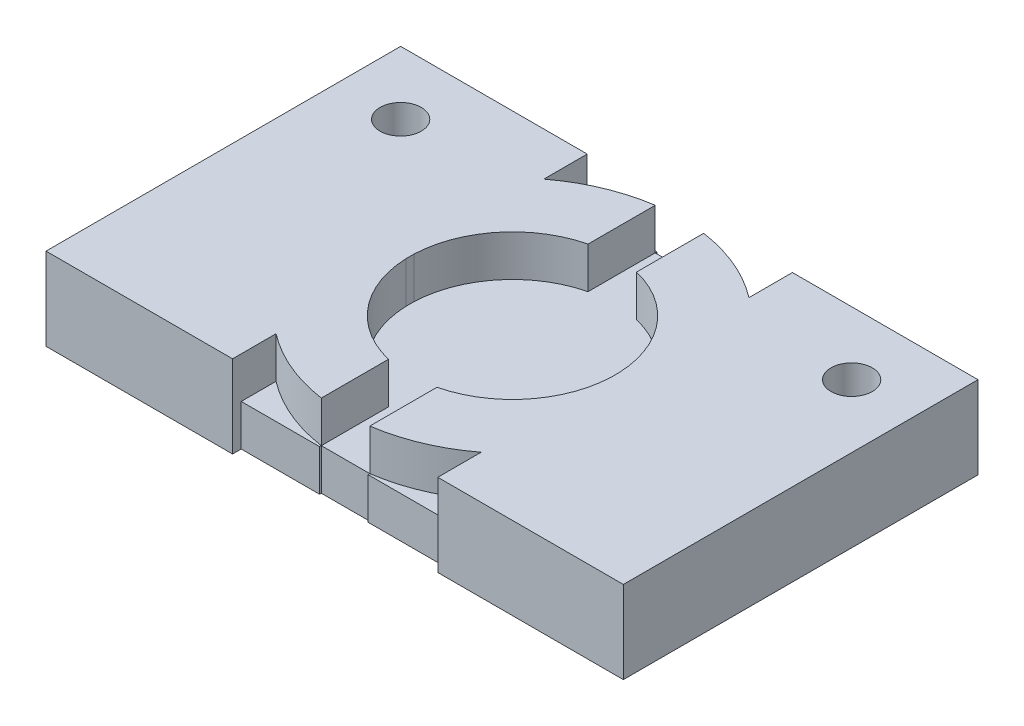
ISO-10303-21;
HEADER;
FILE_DESCRIPTION(('STEP AP214'),'2;1');
FILE_NAME('part.step','',(''),(''),'','','');
FILE_SCHEMA(('AUTOMOTIVE_DESIGN { 1 0 10303 214 1 1 1 1 }'));
ENDSEC;
DATA;
#1=APPLICATION_CONTEXT('core data for automotive mechanical design processes');
#2=APPLICATION_PROTOCOL_DEFINITION('international standard','automotive_design',2000,#1);
#3=PRODUCT_CONTEXT('',#1,'mechanical');
#4=PRODUCT('Part','Part','',(#3));
#5=PRODUCT_RELATED_PRODUCT_CATEGORY('part','',(#4));
#6=PRODUCT_DEFINITION_FORMATION('','',#4);
#7=PRODUCT_DEFINITION_CONTEXT('part definition',#1,'design');
#8=PRODUCT_DEFINITION('design','',#6,#7);
#9=PRODUCT_DEFINITION_SHAPE('','',#8);
#10=(LENGTH_UNIT() NAMED_UNIT(*) SI_UNIT(.MILLI.,.METRE.));
#11=(NAMED_UNIT(*) PLANE_ANGLE_UNIT() SI_UNIT($,.RADIAN.));
#12=(NAMED_UNIT(*) SI_UNIT($,.STERADIAN.) SOLID_ANGLE_UNIT());
#13=UNCERTAINTY_MEASURE_WITH_UNIT(LENGTH_MEASURE(1.E-05),#10,'distance_accuracy_value','');
#14=(GEOMETRIC_REPRESENTATION_CONTEXT(3) GLOBAL_UNCERTAINTY_ASSIGNED_CONTEXT((#13)) GLOBAL_UNIT_ASSIGNED_CONTEXT((#10,
#11,#12)) REPRESENTATION_CONTEXT('',''));
#15=CARTESIAN_POINT('',(0.,0.,0.));
#16=DIRECTION('',(0.,0.,1.));
#17=DIRECTION('',(1.,0.,0.));
#18=AXIS2_PLACEMENT_3D('',#15,#16,#17);
#19=CARTESIAN_POINT('',(-12.38,5.,-21.5));
#20=DIRECTION('',(0.,-1.,0.));
#21=DIRECTION('',(0.,0.,-1.));
#22=AXIS2_PLACEMENT_3D('',#19,#20,#21);
#23=PLANE('',#22);
#24=CARTESIAN_POINT('',(0.0600000000000726,5.,0.));
#25=DIRECTION('',(0.,-1.,0.));
#26=DIRECTION('',(0.,0.,-1.));
#27=AXIS2_PLACEMENT_3D('',#24,#25,#26);
#28=CIRCLE('',#27,20.45);
#29=CARTESIAN_POINT('',(2.99999999999845,5.,20.2375616120127));
#30=VERTEX_POINT('',#29);
#31=CARTESIAN_POINT('',(12.5,5.,16.2311090194109));
#32=VERTEX_POINT('',#31);
#33=EDGE_CURVE('E47',#30,#32,#28,.F.);
#34=ORIENTED_EDGE('',*,*,#33,.F.);
#35=DIRECTION('',(0.,0.,-1.));
#36=VECTOR('',#35,1.);
#37=CARTESIAN_POINT('',(2.99999999999845,5.,20.2375616120127));
#38=LINE('',#37,#36);
#39=CARTESIAN_POINT('',(2.99999999999845,5.,20.45));
#40=VERTEX_POINT('',#39);
#41=EDGE_CURVE('E280',#40,#30,#38,.T.);
#42=ORIENTED_EDGE('',*,*,#41,.F.);
#43=DIRECTION('',(-1.,0.,0.));
#44=VECTOR('',#43,1.);
#45=CARTESIAN_POINT('',(0.0600000000000751,5.,20.45));
#46=LINE('',#45,#44);
#47=CARTESIAN_POINT('',(12.5,5.,20.45));
#48=VERTEX_POINT('',#47);
#49=EDGE_CURVE('E389',#48,#40,#46,.T.);
#50=ORIENTED_EDGE('',*,*,#49,.F.);
#51=DIRECTION('',(0.,0.,1.));
#52=VECTOR('',#51,1.);
#53=CARTESIAN_POINT('',(12.5,5.,-21.5));
#54=LINE('',#53,#52);
#55=EDGE_CURVE('E460',#32,#48,#54,.T.);
#56=ORIENTED_EDGE('',*,*,#55,.F.);
#57=EDGE_LOOP('',(#34,#42,#50,#56));
#58=FACE_BOUND('',#57,.T.);
#59=ADVANCED_FACE('F39',(#58),#23,.F.);
#60=DIRECTION('',(0.,0.,1.));
#61=VECTOR('',#60,1.);
#62=CARTESIAN_POINT('',(-2.88000000000158,5.,12.0978882454745));
#63=LINE('',#62,#61);
#64=CARTESIAN_POINT('',(-2.88000000000158,5.,12.0978882454745));
#65=VERTEX_POINT('',#64);
#66=CARTESIAN_POINT('',(-2.88000000000158,5.,20.2375616120122));
#67=VERTEX_POINT('',#66);
#68=EDGE_CURVE('E318',#65,#67,#63,.T.);
#69=ORIENTED_EDGE('',*,*,#68,.T.);
#70=DIRECTION('',(-1.,0.,0.));
#71=VECTOR('',#70,1.);
#72=CARTESIAN_POINT('',(-2.88000000000158,5.,20.2375616120122));
#73=LINE('',#72,#71);
#74=EDGE_CURVE('E267',#30,#67,#73,.T.);
#75=ORIENTED_EDGE('',*,*,#74,.F.);
#76=DIRECTION('',(0.,0.,-1.));
#77=VECTOR('',#76,1.);
#78=CARTESIAN_POINT('',(2.99999999999845,5.,12.0978882454745));
#79=LINE('',#78,#77);
#80=CARTESIAN_POINT('',(2.99999999999845,5.,12.0978882454753));
#81=VERTEX_POINT('',#80);
#82=EDGE_CURVE('E321',#30,#81,#79,.T.);
#83=ORIENTED_EDGE('',*,*,#82,.T.);
#84=CARTESIAN_POINT('',(0.0600000000000726,5.,0.));
#85=DIRECTION('',(0.,-1.,0.));
#86=DIRECTION('',(0.,0.,-1.));
#87=AXIS2_PLACEMENT_3D('',#84,#85,#86);
#88=CIRCLE('',#87,12.45);
#89=CARTESIAN_POINT('',(12.5,5.,0.49889878733246));
#90=VERTEX_POINT('',#89);
#91=EDGE_CURVE('E516',#81,#90,#88,.F.);
#92=ORIENTED_EDGE('',*,*,#91,.T.);
#93=CARTESIAN_POINT('',(12.5,5.,-0.49889878733246));
#94=VERTEX_POINT('',#93);
#95=EDGE_CURVE('E459',#94,#90,#54,.T.);
#96=ORIENTED_EDGE('',*,*,#95,.F.);
#97=CARTESIAN_POINT('',(2.99999999999833,5.,-12.0978882454749));
#98=VERTEX_POINT('',#97);
#99=EDGE_CURVE('E514',#94,#98,#88,.F.);
#100=ORIENTED_EDGE('',*,*,#99,.T.);
#101=DIRECTION('',(0.,0.,-1.));
#102=VECTOR('',#101,1.);
#103=CARTESIAN_POINT('',(2.99999999999833,5.,-23.0978882454749));
#104=LINE('',#103,#102);
#105=CARTESIAN_POINT('',(3.00000000000178,5.,-20.2375616120122));
#106=VERTEX_POINT('',#105);
#107=EDGE_CURVE('E339',#98,#106,#104,.T.);
#108=ORIENTED_EDGE('',*,*,#107,.T.);
#109=DIRECTION('',(1.,0.,0.));
#110=VECTOR('',#109,1.);
#111=CARTESIAN_POINT('',(3.00000000000178,5.,-20.2375616120122));
#112=LINE('',#111,#110);
#113=CARTESIAN_POINT('',(-2.88000000000167,5.,-20.2375616120122));
#114=VERTEX_POINT('',#113);
#115=EDGE_CURVE('E290',#114,#106,#112,.T.);
#116=ORIENTED_EDGE('',*,*,#115,.F.);
#117=DIRECTION('',(0.,0.,1.));
#118=VECTOR('',#117,1.);
#119=CARTESIAN_POINT('',(-2.88000000000167,5.,-23.0978882454749));
#120=LINE('',#119,#118);
#121=CARTESIAN_POINT('',(-2.88000000000006,5.,-12.0978882454749));
#122=VERTEX_POINT('',#121);
#123=EDGE_CURVE('E342',#114,#122,#120,.T.);
#124=ORIENTED_EDGE('',*,*,#123,.T.);
#125=CARTESIAN_POINT('',(-12.38,5.,-0.498898787328739));
#126=VERTEX_POINT('',#125);
#127=EDGE_CURVE('E513',#122,#126,#88,.F.);
#128=ORIENTED_EDGE('',*,*,#127,.T.);
#129=DIRECTION('',(0.,0.,1.));
#130=VECTOR('',#129,1.);
#131=CARTESIAN_POINT('',(-12.38,5.,-21.5));
#132=LINE('',#131,#130);
#133=CARTESIAN_POINT('',(-12.38,5.,0.498898787328739));
#134=VERTEX_POINT('',#133);
#135=EDGE_CURVE('E464',#126,#134,#132,.T.);
#136=ORIENTED_EDGE('',*,*,#135,.T.);
#137=EDGE_CURVE('E517',#134,#65,#88,.F.);
#138=ORIENTED_EDGE('',*,*,#137,.T.);
#139=EDGE_LOOP('',(#69,#75,#83,#92,#96,#100,#108,#116,#124,#128,#136,#138));
#140=FACE_BOUND('',#139,.T.);
#141=ADVANCED_FACE('F542',(#140),#23,.F.);
#142=CARTESIAN_POINT('',(0.0600000000000751,0.,20.45));
#143=DIRECTION('',(0.,0.,-1.));
#144=DIRECTION('',(-1.,0.,0.));
#145=AXIS2_PLACEMENT_3D('',#142,#143,#144);
#146=PLANE('',#145);
#147=ORIENTED_EDGE('',*,*,#49,.T.);
#148=DIRECTION('',(0.,1.,0.));
#149=VECTOR('',#148,1.);
#150=CARTESIAN_POINT('',(2.99999999999845,0.,20.45));
#151=LINE('',#150,#149);
#152=CARTESIAN_POINT('',(2.99999999999845,0.,20.45));
#153=VERTEX_POINT('',#152);
#154=EDGE_CURVE('E291',#153,#40,#151,.T.);
#155=ORIENTED_EDGE('',*,*,#154,.F.);
#156=DIRECTION('',(-1.,0.,0.));
#157=VECTOR('',#156,1.);
#158=CARTESIAN_POINT('',(-12.38,0.,20.45));
#159=LINE('',#158,#157);
#160=CARTESIAN_POINT('',(12.5,0.,20.45));
#161=VERTEX_POINT('',#160);
#162=EDGE_CURVE('E379',#161,#153,#159,.T.);
#163=ORIENTED_EDGE('',*,*,#162,.F.);
#164=DIRECTION('',(0.,1.,0.));
#165=VECTOR('',#164,1.);
#166=CARTESIAN_POINT('',(12.5,0.,20.45));
#167=LINE('',#166,#165);
#168=EDGE_CURVE('E392',#161,#48,#167,.T.);
#169=ORIENTED_EDGE('',*,*,#168,.T.);
#170=EDGE_LOOP('',(#147,#155,#163,#169));
#171=FACE_BOUND('',#170,.T.);
#172=ADVANCED_FACE('F643',(#171),#146,.F.);
#173=CARTESIAN_POINT('',(0.0600000000000726,5.,0.));
#174=DIRECTION('',(0.,1.,0.));
#175=DIRECTION('',(1.,0.,0.));
#176=AXIS2_PLACEMENT_3D('',#173,#174,#175);
#177=CIRCLE('',#176,20.45);
#178=CARTESIAN_POINT('',(-12.38,5.,-16.2311090194108));
#179=VERTEX_POINT('',#178);
#180=EDGE_CURVE('E412',#114,#179,#177,.T.);
#181=ORIENTED_EDGE('',*,*,#180,.F.);
#182=DIRECTION('',(0.,0.,1.));
#183=VECTOR('',#182,1.);
#184=CARTESIAN_POINT('',(-2.88000000000167,5.,-20.2375616120122));
#185=LINE('',#184,#183);
#186=CARTESIAN_POINT('',(-2.88000000000167,5.,-20.45));
#187=VERTEX_POINT('',#186);
#188=EDGE_CURVE('E298',#187,#114,#185,.T.);
#189=ORIENTED_EDGE('',*,*,#188,.F.);
#190=DIRECTION('',(1.,0.,0.));
#191=VECTOR('',#190,1.);
#192=CARTESIAN_POINT('',(0.0600000000000726,5.,-20.45));
#193=LINE('',#192,#191);
#194=CARTESIAN_POINT('',(-12.38,5.,-20.45));
#195=VERTEX_POINT('',#194);
#196=EDGE_CURVE('E371',#195,#187,#193,.T.);
#197=ORIENTED_EDGE('',*,*,#196,.F.);
#198=EDGE_CURVE('E461',#195,#179,#132,.T.);
#199=ORIENTED_EDGE('',*,*,#198,.T.);
#200=EDGE_LOOP('',(#181,#189,#197,#199));
#201=FACE_BOUND('',#200,.T.);
#202=ADVANCED_FACE('F566',(#201),#23,.F.);
#203=CARTESIAN_POINT('',(-2.88782783499811,5.,20.45));
#204=VERTEX_POINT('',#203);
#205=CARTESIAN_POINT('',(-12.38,5.,20.45));
#206=VERTEX_POINT('',#205);
#207=EDGE_CURVE('E376',#204,#206,#46,.T.);
#208=ORIENTED_EDGE('',*,*,#207,.F.);
#209=DIRECTION('',(-0.0368225648139955,0.,0.999321819395794));
#210=VECTOR('',#209,1.);
#211=CARTESIAN_POINT('',(-2.88782783499811,5.,20.45));
#212=LINE('',#211,#210);
#213=EDGE_CURVE('E54',#67,#204,#212,.T.);
#214=ORIENTED_EDGE('',*,*,#213,.F.);
#215=CARTESIAN_POINT('',(-12.38,5.,16.2311090194108));
#216=VERTEX_POINT('',#215);
#217=EDGE_CURVE('E12',#216,#67,#28,.F.);
#218=ORIENTED_EDGE('',*,*,#217,.F.);
#219=EDGE_CURVE('E442',#216,#206,#132,.T.);
#220=ORIENTED_EDGE('',*,*,#219,.T.);
#221=EDGE_LOOP('',(#208,#214,#218,#220));
#222=FACE_BOUND('',#221,.T.);
#223=ADVANCED_FACE('F605',(#222),#23,.F.);
#224=CARTESIAN_POINT('',(0.0600000000000726,0.,-20.45));
#225=DIRECTION('',(0.,0.,1.));
#226=DIRECTION('',(1.,0.,0.));
#227=AXIS2_PLACEMENT_3D('',#224,#225,#226);
#228=PLANE('',#227);
#229=ORIENTED_EDGE('',*,*,#196,.T.);
#230=DIRECTION('',(0.,1.,0.));
#231=VECTOR('',#230,1.);
#232=CARTESIAN_POINT('',(-2.88000000000167,0.,-20.45));
#233=LINE('',#232,#231);
#234=CARTESIAN_POINT('',(-2.88000000000167,0.,-20.45));
#235=VERTEX_POINT('',#234);
#236=EDGE_CURVE('E313',#235,#187,#233,.T.);
#237=ORIENTED_EDGE('',*,*,#236,.F.);
#238=DIRECTION('',(1.,0.,0.));
#239=VECTOR('',#238,1.);
#240=CARTESIAN_POINT('',(-12.38,0.,-20.45));
#241=LINE('',#240,#239);
#242=CARTESIAN_POINT('',(-12.38,0.,-20.45));
#243=VERTEX_POINT('',#242);
#244=EDGE_CURVE('E360',#243,#235,#241,.T.);
#245=ORIENTED_EDGE('',*,*,#244,.F.);
#246=DIRECTION('',(0.,1.,0.));
#247=VECTOR('',#246,1.);
#248=CARTESIAN_POINT('',(-12.38,0.,-20.45));
#249=LINE('',#248,#247);
#250=EDGE_CURVE('E374',#243,#195,#249,.T.);
#251=ORIENTED_EDGE('',*,*,#250,.T.);
#252=EDGE_LOOP('',(#229,#237,#245,#251));
#253=FACE_BOUND('',#252,.T.);
#254=ADVANCED_FACE('F657',(#253),#228,.F.);
#255=CARTESIAN_POINT('',(0.,10.,0.));
#256=DIRECTION('',(0.,1.,0.));
#257=DIRECTION('',(0.,0.,1.));
#258=AXIS2_PLACEMENT_3D('',#255,#256,#257);
#259=PLANE('',#258);
#260=DIRECTION('',(0.,0.,1.));
#261=VECTOR('',#260,1.);
#262=CARTESIAN_POINT('',(-2.88000000000158,10.,12.0978882454745));
#263=LINE('',#262,#261);
#264=CARTESIAN_POINT('',(-2.88000000000158,10.,12.0978882454745));
#265=VERTEX_POINT('',#264);
#266=CARTESIAN_POINT('',(-2.88000000000158,10.,20.2375616120122));
#267=VERTEX_POINT('',#266);
#268=EDGE_CURVE('E312',#265,#267,#263,.T.);
#269=ORIENTED_EDGE('',*,*,#268,.F.);
#270=CARTESIAN_POINT('',(0.0600000000000726,10.,0.));
#271=DIRECTION('',(0.,1.,0.));
#272=DIRECTION('',(0.,0.,1.));
#273=AXIS2_PLACEMENT_3D('',#270,#271,#272);
#274=CIRCLE('',#273,12.45);
#275=CARTESIAN_POINT('',(-12.38,10.,0.498898787328739));
#276=VERTEX_POINT('',#275);
#277=EDGE_CURVE('E397',#276,#265,#274,.T.);
#278=ORIENTED_EDGE('',*,*,#277,.F.);
#279=DIRECTION('',(0.,0.,1.));
#280=VECTOR('',#279,1.);
#281=CARTESIAN_POINT('',(-12.38,10.,-21.5));
#282=LINE('',#281,#280);
#283=CARTESIAN_POINT('',(-12.38,10.,-0.498898787328739));
#284=VERTEX_POINT('',#283);
#285=EDGE_CURVE('E450',#284,#276,#282,.T.);
#286=ORIENTED_EDGE('',*,*,#285,.F.);
#287=CARTESIAN_POINT('',(-2.88000000000167,10.,-12.0978882454749));
#288=VERTEX_POINT('',#287);
#289=EDGE_CURVE('E400',#288,#284,#274,.T.);
#290=ORIENTED_EDGE('',*,*,#289,.F.);
#291=DIRECTION('',(0.,0.,1.));
#292=VECTOR('',#291,1.);
#293=CARTESIAN_POINT('',(-2.88000000000167,10.,-23.0978882454749));
#294=LINE('',#293,#292);
#295=CARTESIAN_POINT('',(-2.88000000000167,10.,-20.2375616120122));
#296=VERTEX_POINT('',#295);
#297=EDGE_CURVE('E343',#296,#288,#294,.T.);
#298=ORIENTED_EDGE('',*,*,#297,.F.);
#299=CARTESIAN_POINT('',(0.0600000000000726,10.,0.));
#300=DIRECTION('',(0.,1.,0.));
#301=DIRECTION('',(1.,0.,0.));
#302=AXIS2_PLACEMENT_3D('',#299,#300,#301);
#303=CIRCLE('',#302,20.45);
#304=CARTESIAN_POINT('',(-12.38,10.,-16.2311090194108));
#305=VERTEX_POINT('',#304);
#306=EDGE_CURVE('E406',#296,#305,#303,.T.);
#307=ORIENTED_EDGE('',*,*,#306,.T.);
#308=CARTESIAN_POINT('',(-12.38,10.,-21.5));
#309=VERTEX_POINT('',#308);
#310=EDGE_CURVE('E446',#309,#305,#282,.T.);
#311=ORIENTED_EDGE('',*,*,#310,.F.);
#312=DIRECTION('',(-1.,0.,0.));
#313=VECTOR('',#312,1.);
#314=CARTESIAN_POINT('',(-35.,10.,-21.5));
#315=LINE('',#314,#313);
#316=CARTESIAN_POINT('',(-35.,10.,-21.5));
#317=VERTEX_POINT('',#316);
#318=EDGE_CURVE('E480',#309,#317,#315,.T.);
#319=ORIENTED_EDGE('',*,*,#318,.T.);
#320=DIRECTION('',(0.,0.,1.));
#321=VECTOR('',#320,1.);
#322=CARTESIAN_POINT('',(-35.,10.,-21.5));
#323=LINE('',#322,#321);
#324=CARTESIAN_POINT('',(-35.,10.,21.5));
#325=VERTEX_POINT('',#324);
#326=EDGE_CURVE('E485',#317,#325,#323,.T.);
#327=ORIENTED_EDGE('',*,*,#326,.T.);
#328=DIRECTION('',(1.,0.,0.));
#329=VECTOR('',#328,1.);
#330=CARTESIAN_POINT('',(-35.,10.,21.5));
#331=LINE('',#330,#329);
#332=CARTESIAN_POINT('',(-12.38,10.,21.5));
#333=VERTEX_POINT('',#332);
#334=EDGE_CURVE('E488',#325,#333,#331,.T.);
#335=ORIENTED_EDGE('',*,*,#334,.T.);
#336=CARTESIAN_POINT('',(-12.38,10.,16.2311090194108));
#337=VERTEX_POINT('',#336);
#338=EDGE_CURVE('E451',#337,#333,#282,.T.);
#339=ORIENTED_EDGE('',*,*,#338,.F.);
#340=EDGE_CURVE('E408',#337,#267,#303,.T.);
#341=ORIENTED_EDGE('',*,*,#340,.T.);
#342=EDGE_LOOP('',(#269,#278,#286,#290,#298,#307,#311,#319,#327,#335,#339,#341));
#343=FACE_BOUND('',#342,.T.);
#344=CARTESIAN_POINT('',(-27.34,10.,-13.84));
#345=DIRECTION('',(0.,1.,0.));
#346=DIRECTION('',(0.,0.,1.));
#347=AXIS2_PLACEMENT_3D('',#344,#345,#346);
#348=CIRCLE('',#347,2.5);
#349=CARTESIAN_POINT('',(-27.34,10.,-11.34));
#350=VERTEX_POINT('',#349);
#351=EDGE_CURVE('E468',#350,#350,#348,.T.);
#352=ORIENTED_EDGE('',*,*,#351,.F.);
#353=EDGE_LOOP('',(#352));
#354=FACE_BOUND('',#353,.T.);
#355=ADVANCED_FACE('F574',(#343,#354),#259,.T.);
#356=CARTESIAN_POINT('',(0.0600000000000726,10.,0.));
#357=DIRECTION('',(0.,-1.,0.));
#358=DIRECTION('',(0.,0.,-1.));
#359=AXIS2_PLACEMENT_3D('',#356,#357,#358);
#360=CYLINDRICAL_SURFACE('',#359,20.45);
#361=ORIENTED_EDGE('',*,*,#217,.T.);
#362=DIRECTION('',(0.,-1.,0.));
#363=VECTOR('',#362,1.);
#364=CARTESIAN_POINT('',(-2.88000000000158,10.,20.2375616120122));
#365=LINE('',#364,#363);
#366=EDGE_CURVE('E335',#67,#267,#365,.F.);
#367=ORIENTED_EDGE('',*,*,#366,.T.);
#368=ORIENTED_EDGE('',*,*,#340,.F.);
#369=DIRECTION('',(0.,-1.,0.));
#370=VECTOR('',#369,1.);
#371=CARTESIAN_POINT('',(-12.38,10.,16.2311090194108));
#372=LINE('',#371,#370);
#373=EDGE_CURVE('E430',#337,#216,#372,.T.);
#374=ORIENTED_EDGE('',*,*,#373,.T.);
#375=EDGE_LOOP('',(#361,#367,#368,#374));
#376=FACE_BOUND('',#375,.T.);
#377=ADVANCED_FACE('F620',(#376),#360,.T.);
#378=CARTESIAN_POINT('',(0.0600000000000726,10.,0.));
#379=DIRECTION('',(0.,-1.,0.));
#380=DIRECTION('',(0.,0.,-1.));
#381=AXIS2_PLACEMENT_3D('',#378,#379,#380);
#382=CYLINDRICAL_SURFACE('',#381,12.45);
#383=DIRECTION('',(0.,1.,0.));
#384=VECTOR('',#383,1.);
#385=CARTESIAN_POINT('',(-2.88000000000158,5.,12.0978882454745));
#386=LINE('',#385,#384);
#387=EDGE_CURVE('E328',#65,#265,#386,.T.);
#388=ORIENTED_EDGE('',*,*,#387,.F.);
#389=ORIENTED_EDGE('',*,*,#137,.F.);
#390=DIRECTION('',(0.,-1.,0.));
#391=VECTOR('',#390,1.);
#392=CARTESIAN_POINT('',(-12.38,10.,0.498898787328739));
#393=LINE('',#392,#391);
#394=EDGE_CURVE('E418',#276,#134,#393,.T.);
#395=ORIENTED_EDGE('',*,*,#394,.F.);
#396=ORIENTED_EDGE('',*,*,#277,.T.);
#397=EDGE_LOOP('',(#388,#389,#395,#396));
#398=FACE_BOUND('',#397,.T.);
#399=ADVANCED_FACE('F615',(#398),#382,.F.);
#400=CARTESIAN_POINT('',(12.5,5.,-16.2311090194109));
#401=VERTEX_POINT('',#400);
#402=EDGE_CURVE('E409',#401,#106,#177,.T.);
#403=ORIENTED_EDGE('',*,*,#402,.T.);
#404=DIRECTION('',(0.,-1.,0.));
#405=VECTOR('',#404,1.);
#406=CARTESIAN_POINT('',(2.99999999999833,10.,-20.2375616120127));
#407=LINE('',#406,#405);
#408=CARTESIAN_POINT('',(2.99999999999833,10.,-20.2375616120127));
#409=VERTEX_POINT('',#408);
#410=EDGE_CURVE('E356',#106,#409,#407,.F.);
#411=ORIENTED_EDGE('',*,*,#410,.T.);
#412=CARTESIAN_POINT('',(12.5,10.,-16.2311090194109));
#413=VERTEX_POINT('',#412);
#414=EDGE_CURVE('E402',#413,#409,#303,.T.);
#415=ORIENTED_EDGE('',*,*,#414,.F.);
#416=DIRECTION('',(0.,-1.,0.));
#417=VECTOR('',#416,1.);
#418=CARTESIAN_POINT('',(12.5,10.,-16.2311090194109));
#419=LINE('',#418,#417);
#420=EDGE_CURVE('E424',#413,#401,#419,.T.);
#421=ORIENTED_EDGE('',*,*,#420,.T.);
#422=EDGE_LOOP('',(#403,#411,#415,#421));
#423=FACE_BOUND('',#422,.T.);
#424=ADVANCED_FACE('F684',(#423),#360,.T.);
#425=DIRECTION('',(0.,1.,0.));
#426=VECTOR('',#425,1.);
#427=CARTESIAN_POINT('',(2.99999999999833,5.,-12.0978882454749));
#428=LINE('',#427,#426);
#429=CARTESIAN_POINT('',(2.99999999999833,10.,-12.0978882454749));
#430=VERTEX_POINT('',#429);
#431=EDGE_CURVE('E349',#98,#430,#428,.T.);
#432=ORIENTED_EDGE('',*,*,#431,.F.);
#433=ORIENTED_EDGE('',*,*,#99,.F.);
#434=DIRECTION('',(0.,-1.,0.));
#435=VECTOR('',#434,1.);
#436=CARTESIAN_POINT('',(12.5,10.,-0.49889878733246));
#437=LINE('',#436,#435);
#438=CARTESIAN_POINT('',(12.5,10.,-0.49889878733246));
#439=VERTEX_POINT('',#438);
#440=EDGE_CURVE('E405',#439,#94,#437,.T.);
#441=ORIENTED_EDGE('',*,*,#440,.F.);
#442=EDGE_CURVE('E401',#439,#430,#274,.T.);
#443=ORIENTED_EDGE('',*,*,#442,.T.);
#444=EDGE_LOOP('',(#432,#433,#441,#443));
#445=FACE_BOUND('',#444,.T.);
#446=ADVANCED_FACE('F680',(#445),#382,.F.);
#447=CARTESIAN_POINT('',(-35.,10.,-21.5));
#448=DIRECTION('',(0.,0.,1.));
#449=DIRECTION('',(1.,0.,0.));
#450=AXIS2_PLACEMENT_3D('',#447,#448,#449);
#451=PLANE('',#450);
#452=DIRECTION('',(0.,-1.,0.));
#453=VECTOR('',#452,1.);
#454=CARTESIAN_POINT('',(-12.38,10.,-21.5));
#455=LINE('',#454,#453);
#456=CARTESIAN_POINT('',(-12.38,0.,-21.5));
#457=VERTEX_POINT('',#456);
#458=EDGE_CURVE('E436',#309,#457,#455,.T.);
#459=ORIENTED_EDGE('',*,*,#458,.T.);
#460=DIRECTION('',(-1.,0.,0.));
#461=VECTOR('',#460,1.);
#462=CARTESIAN_POINT('',(-35.,0.,-21.5));
#463=LINE('',#462,#461);
#464=CARTESIAN_POINT('',(-35.,0.,-21.5));
#465=VERTEX_POINT('',#464);
#466=EDGE_CURVE('E494',#457,#465,#463,.T.);
#467=ORIENTED_EDGE('',*,*,#466,.T.);
#468=DIRECTION('',(0.,-1.,0.));
#469=VECTOR('',#468,1.);
#470=CARTESIAN_POINT('',(-35.,10.,-21.5));
#471=LINE('',#470,#469);
#472=EDGE_CURVE('E508',#317,#465,#471,.T.);
#473=ORIENTED_EDGE('',*,*,#472,.F.);
#474=ORIENTED_EDGE('',*,*,#318,.F.);
#475=EDGE_LOOP('',(#459,#467,#473,#474));
#476=FACE_BOUND('',#475,.T.);
#477=ADVANCED_FACE('F579',(#476),#451,.F.);
#478=CARTESIAN_POINT('',(-35.,10.,21.5));
#479=DIRECTION('',(0.,0.,-1.));
#480=DIRECTION('',(-1.,0.,0.));
#481=AXIS2_PLACEMENT_3D('',#478,#479,#480);
#482=PLANE('',#481);
#483=DIRECTION('',(0.,1.,0.));
#484=VECTOR('',#483,1.);
#485=CARTESIAN_POINT('',(12.5,10.,21.5));
#486=LINE('',#485,#484);
#487=CARTESIAN_POINT('',(12.5,0.,21.5));
#488=VERTEX_POINT('',#487);
#489=CARTESIAN_POINT('',(12.5,10.,21.5));
#490=VERTEX_POINT('',#489);
#491=EDGE_CURVE('E439',#488,#490,#486,.T.);
#492=ORIENTED_EDGE('',*,*,#491,.F.);
#493=DIRECTION('',(1.,0.,0.));
#494=VECTOR('',#493,1.);
#495=CARTESIAN_POINT('',(-35.,0.,21.5));
#496=LINE('',#495,#494);
#497=CARTESIAN_POINT('',(35.,0.,21.5));
#498=VERTEX_POINT('',#497);
#499=EDGE_CURVE('E500',#488,#498,#496,.T.);
#500=ORIENTED_EDGE('',*,*,#499,.T.);
#501=DIRECTION('',(0.,-1.,0.));
#502=VECTOR('',#501,1.);
#503=CARTESIAN_POINT('',(35.,10.,21.5));
#504=LINE('',#503,#502);
#505=CARTESIAN_POINT('',(35.,10.,21.5));
#506=VERTEX_POINT('',#505);
#507=EDGE_CURVE('E491',#506,#498,#504,.T.);
#508=ORIENTED_EDGE('',*,*,#507,.F.);
#509=EDGE_CURVE('E487',#490,#506,#331,.T.);
#510=ORIENTED_EDGE('',*,*,#509,.F.);
#511=EDGE_LOOP('',(#492,#500,#508,#510));
#512=FACE_BOUND('',#511,.T.);
#513=ADVANCED_FACE('F691',(#512),#482,.F.);
#514=CARTESIAN_POINT('',(-12.38,10.,-21.5));
#515=DIRECTION('',(-1.,0.,0.));
#516=DIRECTION('',(0.,0.,1.));
#517=AXIS2_PLACEMENT_3D('',#514,#515,#516);
#518=PLANE('',#517);
#519=DIRECTION('',(0.,-1.,0.));
#520=VECTOR('',#519,1.);
#521=CARTESIAN_POINT('',(-12.38,10.,-16.2311090194108));
#522=LINE('',#521,#520);
#523=EDGE_CURVE('E432',#179,#305,#522,.F.);
#524=ORIENTED_EDGE('',*,*,#523,.F.);
#525=ORIENTED_EDGE('',*,*,#198,.F.);
#526=ORIENTED_EDGE('',*,*,#250,.F.);
#527=DIRECTION('',(0.,0.,1.));
#528=VECTOR('',#527,1.);
#529=CARTESIAN_POINT('',(-12.38,0.,-21.5));
#530=LINE('',#529,#528);
#531=EDGE_CURVE('E367',#457,#243,#530,.T.);
#532=ORIENTED_EDGE('',*,*,#531,.F.);
#533=ORIENTED_EDGE('',*,*,#458,.F.);
#534=ORIENTED_EDGE('',*,*,#310,.T.);
#535=EDGE_LOOP('',(#524,#525,#526,#532,#533,#534));
#536=FACE_BOUND('',#535,.T.);
#537=ADVANCED_FACE('F568',(#536),#518,.F.);
#538=ORIENTED_EDGE('',*,*,#373,.F.);
#539=ORIENTED_EDGE('',*,*,#338,.T.);
#540=DIRECTION('',(0.,-1.,0.));
#541=VECTOR('',#540,1.);
#542=CARTESIAN_POINT('',(-12.38,10.,21.5));
#543=LINE('',#542,#541);
#544=CARTESIAN_POINT('',(-12.38,0.,21.5));
#545=VERTEX_POINT('',#544);
#546=EDGE_CURVE('E435',#333,#545,#543,.T.);
#547=ORIENTED_EDGE('',*,*,#546,.T.);
#548=DIRECTION('',(0.,0.,1.));
#549=VECTOR('',#548,1.);
#550=CARTESIAN_POINT('',(-12.38,0.,21.5));
#551=LINE('',#550,#549);
#552=CARTESIAN_POINT('',(-12.38,0.,20.45));
#553=VERTEX_POINT('',#552);
#554=EDGE_CURVE('E381',#553,#545,#551,.T.);
#555=ORIENTED_EDGE('',*,*,#554,.F.);
#556=DIRECTION('',(0.,1.,0.));
#557=VECTOR('',#556,1.);
#558=CARTESIAN_POINT('',(-12.38,0.,20.45));
#559=LINE('',#558,#557);
#560=EDGE_CURVE('E388',#553,#206,#559,.T.);
#561=ORIENTED_EDGE('',*,*,#560,.T.);
#562=ORIENTED_EDGE('',*,*,#219,.F.);
#563=EDGE_LOOP('',(#538,#539,#547,#555,#561,#562));
#564=FACE_BOUND('',#563,.T.);
#565=ADVANCED_FACE('F596',(#564),#518,.F.);
#566=CARTESIAN_POINT('',(12.5,10.,-21.5));
#567=DIRECTION('',(1.,0.,0.));
#568=DIRECTION('',(0.,0.,-1.));
#569=AXIS2_PLACEMENT_3D('',#566,#567,#568);
#570=PLANE('',#569);
#571=DIRECTION('',(0.,-1.,0.));
#572=VECTOR('',#571,1.);
#573=CARTESIAN_POINT('',(12.5,10.,16.2311090194109));
#574=LINE('',#573,#572);
#575=CARTESIAN_POINT('',(12.5,10.,16.2311090194109));
#576=VERTEX_POINT('',#575);
#577=EDGE_CURVE('E427',#32,#576,#574,.F.);
#578=ORIENTED_EDGE('',*,*,#577,.F.);
#579=ORIENTED_EDGE('',*,*,#55,.T.);
#580=ORIENTED_EDGE('',*,*,#168,.F.);
#581=DIRECTION('',(0.,0.,-1.));
#582=VECTOR('',#581,1.);
#583=CARTESIAN_POINT('',(12.5,0.,20.45));
#584=LINE('',#583,#582);
#585=EDGE_CURVE('E385',#488,#161,#584,.T.);
#586=ORIENTED_EDGE('',*,*,#585,.F.);
#587=ORIENTED_EDGE('',*,*,#491,.T.);
#588=DIRECTION('',(0.,0.,1.));
#589=VECTOR('',#588,1.);
#590=CARTESIAN_POINT('',(12.5,10.,-21.5));
#591=LINE('',#590,#589);
#592=EDGE_CURVE('E456',#576,#490,#591,.T.);
#593=ORIENTED_EDGE('',*,*,#592,.F.);
#594=EDGE_LOOP('',(#578,#579,#580,#586,#587,#593));
#595=FACE_BOUND('',#594,.T.);
#596=ADVANCED_FACE('F533',(#595),#570,.F.);
#597=ORIENTED_EDGE('',*,*,#420,.F.);
#598=CARTESIAN_POINT('',(12.5,10.,-21.5));
#599=VERTEX_POINT('',#598);
#600=EDGE_CURVE('E452',#599,#413,#591,.T.);
#601=ORIENTED_EDGE('',*,*,#600,.F.);
#602=DIRECTION('',(0.,1.,0.));
#603=VECTOR('',#602,1.);
#604=CARTESIAN_POINT('',(12.5,10.,-21.5));
#605=LINE('',#604,#603);
#606=CARTESIAN_POINT('',(12.5,0.,-21.5));
#607=VERTEX_POINT('',#606);
#608=EDGE_CURVE('E438',#607,#599,#605,.T.);
#609=ORIENTED_EDGE('',*,*,#608,.F.);
#610=DIRECTION('',(0.,0.,-1.));
#611=VECTOR('',#610,1.);
#612=CARTESIAN_POINT('',(12.5,0.,-20.45));
#613=LINE('',#612,#611);
#614=CARTESIAN_POINT('',(12.5,0.,-20.45));
#615=VERTEX_POINT('',#614);
#616=EDGE_CURVE('E363',#615,#607,#613,.T.);
#617=ORIENTED_EDGE('',*,*,#616,.F.);
#618=DIRECTION('',(0.,1.,0.));
#619=VECTOR('',#618,1.);
#620=CARTESIAN_POINT('',(12.5,0.,-20.45));
#621=LINE('',#620,#619);
#622=CARTESIAN_POINT('',(12.5,5.,-20.45));
#623=VERTEX_POINT('',#622);
#624=EDGE_CURVE('E370',#615,#623,#621,.T.);
#625=ORIENTED_EDGE('',*,*,#624,.T.);
#626=EDGE_CURVE('E457',#623,#401,#54,.T.);
#627=ORIENTED_EDGE('',*,*,#626,.T.);
#628=EDGE_LOOP('',(#597,#601,#609,#617,#625,#627));
#629=FACE_BOUND('',#628,.T.);
#630=ADVANCED_FACE('F654',(#629),#570,.F.);
#631=CARTESIAN_POINT('',(35.,10.,-21.5));
#632=DIRECTION('',(-1.,0.,0.));
#633=DIRECTION('',(0.,0.,1.));
#634=AXIS2_PLACEMENT_3D('',#631,#632,#633);
#635=PLANE('',#634);
#636=DIRECTION('',(0.,0.,-1.));
#637=VECTOR('',#636,1.);
#638=CARTESIAN_POINT('',(35.,0.,-21.5));
#639=LINE('',#638,#637);
#640=CARTESIAN_POINT('',(35.,0.,-21.5));
#641=VERTEX_POINT('',#640);
#642=EDGE_CURVE('E474',#498,#641,#639,.T.);
#643=ORIENTED_EDGE('',*,*,#642,.T.);
#644=DIRECTION('',(0.,-1.,0.));
#645=VECTOR('',#644,1.);
#646=CARTESIAN_POINT('',(35.,10.,-21.5));
#647=LINE('',#646,#645);
#648=CARTESIAN_POINT('',(35.,10.,-21.5));
#649=VERTEX_POINT('',#648);
#650=EDGE_CURVE('E511',#649,#641,#647,.T.);
#651=ORIENTED_EDGE('',*,*,#650,.F.);
#652=DIRECTION('',(0.,0.,-1.));
#653=VECTOR('',#652,1.);
#654=CARTESIAN_POINT('',(35.,10.,-21.5));
#655=LINE('',#654,#653);
#656=EDGE_CURVE('E477',#506,#649,#655,.T.);
#657=ORIENTED_EDGE('',*,*,#656,.F.);
#658=ORIENTED_EDGE('',*,*,#507,.T.);
#659=EDGE_LOOP('',(#643,#651,#657,#658));
#660=FACE_BOUND('',#659,.T.);
#661=ADVANCED_FACE('F41',(#660),#635,.F.);
#662=EDGE_CURVE('E495',#641,#607,#463,.T.);
#663=ORIENTED_EDGE('',*,*,#662,.T.);
#664=ORIENTED_EDGE('',*,*,#608,.T.);
#665=EDGE_CURVE('E482',#649,#599,#315,.T.);
#666=ORIENTED_EDGE('',*,*,#665,.F.);
#667=ORIENTED_EDGE('',*,*,#650,.T.);
#668=EDGE_LOOP('',(#663,#664,#666,#667));
#669=FACE_BOUND('',#668,.T.);
#670=ADVANCED_FACE('F692',(#669),#451,.F.);
#671=CARTESIAN_POINT('',(-35.,10.,-21.5));
#672=DIRECTION('',(1.,0.,0.));
#673=DIRECTION('',(0.,0.,-1.));
#674=AXIS2_PLACEMENT_3D('',#671,#672,#673);
#675=PLANE('',#674);
#676=DIRECTION('',(0.,0.,1.));
#677=VECTOR('',#676,1.);
#678=CARTESIAN_POINT('',(-35.,0.,-21.5));
#679=LINE('',#678,#677);
#680=CARTESIAN_POINT('',(-35.,0.,21.5));
#681=VERTEX_POINT('',#680);
#682=EDGE_CURVE('E498',#465,#681,#679,.T.);
#683=ORIENTED_EDGE('',*,*,#682,.T.);
#684=DIRECTION('',(0.,-1.,0.));
#685=VECTOR('',#684,1.);
#686=CARTESIAN_POINT('',(-35.,10.,21.5));
#687=LINE('',#686,#685);
#688=EDGE_CURVE('E505',#325,#681,#687,.T.);
#689=ORIENTED_EDGE('',*,*,#688,.F.);
#690=ORIENTED_EDGE('',*,*,#326,.F.);
#691=ORIENTED_EDGE('',*,*,#472,.T.);
#692=EDGE_LOOP('',(#683,#689,#690,#691));
#693=FACE_BOUND('',#692,.T.);
#694=ADVANCED_FACE('F585',(#693),#675,.F.);
#695=EDGE_CURVE('E481',#681,#545,#496,.T.);
#696=ORIENTED_EDGE('',*,*,#695,.T.);
#697=ORIENTED_EDGE('',*,*,#546,.F.);
#698=ORIENTED_EDGE('',*,*,#334,.F.);
#699=ORIENTED_EDGE('',*,*,#688,.T.);
#700=EDGE_LOOP('',(#696,#697,#698,#699));
#701=FACE_BOUND('',#700,.T.);
#702=ADVANCED_FACE('F591',(#701),#482,.F.);
#703=DIRECTION('',(0.,0.,-1.));
#704=VECTOR('',#703,1.);
#705=CARTESIAN_POINT('',(2.99999999999845,10.,12.0978882454745));
#706=LINE('',#705,#704);
#707=CARTESIAN_POINT('',(2.99999999999845,10.,20.2375616120127));
#708=VERTEX_POINT('',#707);
#709=CARTESIAN_POINT('',(2.99999999999845,10.,12.0978882454745));
#710=VERTEX_POINT('',#709);
#711=EDGE_CURVE('E322',#708,#710,#706,.T.);
#712=ORIENTED_EDGE('',*,*,#711,.F.);
#713=EDGE_CURVE('E407',#708,#576,#303,.T.);
#714=ORIENTED_EDGE('',*,*,#713,.T.);
#715=ORIENTED_EDGE('',*,*,#592,.T.);
#716=ORIENTED_EDGE('',*,*,#509,.T.);
#717=ORIENTED_EDGE('',*,*,#656,.T.);
#718=ORIENTED_EDGE('',*,*,#665,.T.);
#719=ORIENTED_EDGE('',*,*,#600,.T.);
#720=ORIENTED_EDGE('',*,*,#414,.T.);
#721=DIRECTION('',(0.,0.,-1.));
#722=VECTOR('',#721,1.);
#723=CARTESIAN_POINT('',(2.99999999999833,10.,-23.0978882454749));
#724=LINE('',#723,#722);
#725=EDGE_CURVE('E338',#430,#409,#724,.T.);
#726=ORIENTED_EDGE('',*,*,#725,.F.);
#727=ORIENTED_EDGE('',*,*,#442,.F.);
#728=CARTESIAN_POINT('',(12.5,10.,0.49889878733246));
#729=VERTEX_POINT('',#728);
#730=EDGE_CURVE('E455',#439,#729,#591,.T.);
#731=ORIENTED_EDGE('',*,*,#730,.T.);
#732=EDGE_CURVE('E394',#710,#729,#274,.T.);
#733=ORIENTED_EDGE('',*,*,#732,.F.);
#734=EDGE_LOOP('',(#712,#714,#715,#716,#717,#718,#719,#720,#726,#727,#731,#733));
#735=FACE_BOUND('',#734,.T.);
#736=CARTESIAN_POINT('',(27.34,10.,-13.84));
#737=DIRECTION('',(0.,1.,0.));
#738=DIRECTION('',(0.,0.,1.));
#739=AXIS2_PLACEMENT_3D('',#736,#737,#738);
#740=CIRCLE('',#739,2.5);
#741=CARTESIAN_POINT('',(27.34,10.,-11.34));
#742=VERTEX_POINT('',#741);
#743=EDGE_CURVE('E449',#742,#742,#740,.T.);
#744=ORIENTED_EDGE('',*,*,#743,.F.);
#745=EDGE_LOOP('',(#744));
#746=FACE_BOUND('',#745,.T.);
#747=ADVANCED_FACE('F621',(#735,#746),#259,.T.);
#748=CARTESIAN_POINT('',(0.,0.,0.));
#749=DIRECTION('',(0.,1.,0.));
#750=DIRECTION('',(0.,0.,1.));
#751=AXIS2_PLACEMENT_3D('',#748,#749,#750);
#752=PLANE('',#751);
#753=ORIENTED_EDGE('',*,*,#162,.T.);
#754=DIRECTION('',(0.,0.,-1.));
#755=VECTOR('',#754,1.);
#756=CARTESIAN_POINT('',(2.99999999999845,0.,20.2375616120127));
#757=LINE('',#756,#755);
#758=CARTESIAN_POINT('',(2.99999999999845,0.,20.2375616120127));
#759=VERTEX_POINT('',#758);
#760=EDGE_CURVE('E269',#153,#759,#757,.T.);
#761=ORIENTED_EDGE('',*,*,#760,.T.);
#762=DIRECTION('',(-1.,0.,0.));
#763=VECTOR('',#762,1.);
#764=CARTESIAN_POINT('',(-2.88000000000158,0.,20.2375616120122));
#765=LINE('',#764,#763);
#766=CARTESIAN_POINT('',(-2.88000000000158,0.,20.2375616120122));
#767=VERTEX_POINT('',#766);
#768=EDGE_CURVE('E264',#759,#767,#765,.T.);
#769=ORIENTED_EDGE('',*,*,#768,.T.);
#770=DIRECTION('',(-0.0368225648139955,0.,0.999321819395794));
#771=VECTOR('',#770,1.);
#772=CARTESIAN_POINT('',(-2.88782783499811,0.,20.45));
#773=LINE('',#772,#771);
#774=CARTESIAN_POINT('',(-2.88782783499811,0.,20.45));
#775=VERTEX_POINT('',#774);
#776=EDGE_CURVE('E272',#767,#775,#773,.T.);
#777=ORIENTED_EDGE('',*,*,#776,.T.);
#778=EDGE_CURVE('E382',#775,#553,#159,.T.);
#779=ORIENTED_EDGE('',*,*,#778,.T.);
#780=ORIENTED_EDGE('',*,*,#554,.T.);
#781=ORIENTED_EDGE('',*,*,#695,.F.);
#782=ORIENTED_EDGE('',*,*,#682,.F.);
#783=ORIENTED_EDGE('',*,*,#466,.F.);
#784=ORIENTED_EDGE('',*,*,#531,.T.);
#785=ORIENTED_EDGE('',*,*,#244,.T.);
#786=DIRECTION('',(0.,0.,1.));
#787=VECTOR('',#786,1.);
#788=CARTESIAN_POINT('',(-2.88000000000167,0.,-20.2375616120122));
#789=LINE('',#788,#787);
#790=CARTESIAN_POINT('',(-2.88000000000167,0.,-20.2375616120122));
#791=VERTEX_POINT('',#790);
#792=EDGE_CURVE('E301',#235,#791,#789,.T.);
#793=ORIENTED_EDGE('',*,*,#792,.T.);
#794=DIRECTION('',(1.,0.,0.));
#795=VECTOR('',#794,1.);
#796=CARTESIAN_POINT('',(3.00000000000178,0.,-20.2375616120122));
#797=LINE('',#796,#795);
#798=CARTESIAN_POINT('',(3.00000000000178,0.,-20.2375616120122));
#799=VERTEX_POINT('',#798);
#800=EDGE_CURVE('E294',#791,#799,#797,.T.);
#801=ORIENTED_EDGE('',*,*,#800,.T.);
#802=DIRECTION('',(-0.0584650837813112,0.,-0.998289454005422));
#803=VECTOR('',#802,1.);
#804=CARTESIAN_POINT('',(2.98755849007473,0.,-20.45));
#805=LINE('',#804,#803);
#806=CARTESIAN_POINT('',(2.98755849007473,0.,-20.45));
#807=VERTEX_POINT('',#806);
#808=EDGE_CURVE('E297',#799,#807,#805,.T.);
#809=ORIENTED_EDGE('',*,*,#808,.T.);
#810=EDGE_CURVE('E364',#807,#615,#241,.T.);
#811=ORIENTED_EDGE('',*,*,#810,.T.);
#812=ORIENTED_EDGE('',*,*,#616,.T.);
#813=ORIENTED_EDGE('',*,*,#662,.F.);
#814=ORIENTED_EDGE('',*,*,#642,.F.);
#815=ORIENTED_EDGE('',*,*,#499,.F.);
#816=ORIENTED_EDGE('',*,*,#585,.T.);
#817=EDGE_LOOP('',(#753,#761,#769,#777,#779,#780,#781,#782,#783,#784,#785,#793,#801,#809,#811,
#812,#813,#814,#815,#816));
#818=FACE_BOUND('',#817,.T.);
#819=CARTESIAN_POINT('',(27.34,0.,-13.84));
#820=DIRECTION('',(0.,1.,0.));
#821=DIRECTION('',(0.,0.,1.));
#822=AXIS2_PLACEMENT_3D('',#819,#820,#821);
#823=CIRCLE('',#822,2.5);
#824=CARTESIAN_POINT('',(27.34,0.,-11.34));
#825=VERTEX_POINT('',#824);
#826=EDGE_CURVE('E465',#825,#825,#823,.T.);
#827=ORIENTED_EDGE('',*,*,#826,.T.);
#828=EDGE_LOOP('',(#827));
#829=FACE_BOUND('',#828,.T.);
#830=CARTESIAN_POINT('',(-27.34,0.,-13.84));
#831=DIRECTION('',(0.,1.,0.));
#832=DIRECTION('',(0.,0.,1.));
#833=AXIS2_PLACEMENT_3D('',#830,#831,#832);
#834=CIRCLE('',#833,2.5);
#835=CARTESIAN_POINT('',(-27.34,0.,-11.34));
#836=VERTEX_POINT('',#835);
#837=EDGE_CURVE('E471',#836,#836,#834,.T.);
#838=ORIENTED_EDGE('',*,*,#837,.T.);
#839=EDGE_LOOP('',(#838));
#840=FACE_BOUND('',#839,.T.);
#841=ADVANCED_FACE('F278',(#818,#829,#840),#752,.F.);
#842=CARTESIAN_POINT('',(-27.34,0.,-13.84));
#843=DIRECTION('',(0.,1.,0.));
#844=DIRECTION('',(0.,0.,1.));
#845=AXIS2_PLACEMENT_3D('',#842,#843,#844);
#846=CYLINDRICAL_SURFACE('',#845,2.5);
#847=ORIENTED_EDGE('',*,*,#837,.F.);
#848=EDGE_LOOP('',(#847));
#849=FACE_BOUND('',#848,.T.);
#850=ORIENTED_EDGE('',*,*,#351,.T.);
#851=EDGE_LOOP('',(#850));
#852=FACE_BOUND('',#851,.T.);
#853=ADVANCED_FACE('F711',(#849,#852),#846,.F.);
#854=CARTESIAN_POINT('',(27.34,0.,-13.84));
#855=DIRECTION('',(0.,1.,0.));
#856=DIRECTION('',(0.,0.,1.));
#857=AXIS2_PLACEMENT_3D('',#854,#855,#856);
#858=CYLINDRICAL_SURFACE('',#857,2.5);
#859=ORIENTED_EDGE('',*,*,#826,.F.);
#860=EDGE_LOOP('',(#859));
#861=FACE_BOUND('',#860,.T.);
#862=ORIENTED_EDGE('',*,*,#743,.T.);
#863=EDGE_LOOP('',(#862));
#864=FACE_BOUND('',#863,.T.);
#865=ADVANCED_FACE('F894',(#861,#864),#858,.F.);
#866=ORIENTED_EDGE('',*,*,#135,.F.);
#867=DIRECTION('',(0.,-1.,0.));
#868=VECTOR('',#867,1.);
#869=CARTESIAN_POINT('',(-12.38,10.,-0.498898787328739));
#870=LINE('',#869,#868);
#871=EDGE_CURVE('E421',#126,#284,#870,.F.);
#872=ORIENTED_EDGE('',*,*,#871,.T.);
#873=ORIENTED_EDGE('',*,*,#285,.T.);
#874=ORIENTED_EDGE('',*,*,#394,.T.);
#875=EDGE_LOOP('',(#866,#872,#873,#874));
#876=FACE_BOUND('',#875,.T.);
#877=ADVANCED_FACE('F609',(#876),#518,.F.);
#878=ORIENTED_EDGE('',*,*,#95,.T.);
#879=DIRECTION('',(0.,-1.,0.));
#880=VECTOR('',#879,1.);
#881=CARTESIAN_POINT('',(12.5,10.,0.49889878733246));
#882=LINE('',#881,#880);
#883=EDGE_CURVE('E415',#90,#729,#882,.F.);
#884=ORIENTED_EDGE('',*,*,#883,.T.);
#885=ORIENTED_EDGE('',*,*,#730,.F.);
#886=ORIENTED_EDGE('',*,*,#440,.T.);
#887=EDGE_LOOP('',(#878,#884,#885,#886));
#888=FACE_BOUND('',#887,.T.);
#889=ADVANCED_FACE('F538',(#888),#570,.F.);
#890=CARTESIAN_POINT('',(2.98755849007473,5.,-20.45));
#891=VERTEX_POINT('',#890);
#892=EDGE_CURVE('E359',#891,#623,#193,.T.);
#893=ORIENTED_EDGE('',*,*,#892,.F.);
#894=DIRECTION('',(-0.0584650837813112,0.,-0.998289454005422));
#895=VECTOR('',#894,1.);
#896=CARTESIAN_POINT('',(2.98755849007473,5.,-20.45));
#897=LINE('',#896,#895);
#898=EDGE_CURVE('E62',#106,#891,#897,.T.);
#899=ORIENTED_EDGE('',*,*,#898,.F.);
#900=ORIENTED_EDGE('',*,*,#402,.F.);
#901=ORIENTED_EDGE('',*,*,#626,.F.);
#902=EDGE_LOOP('',(#893,#899,#900,#901));
#903=FACE_BOUND('',#902,.T.);
#904=ADVANCED_FACE('F639',(#903),#23,.F.);
#905=ORIENTED_EDGE('',*,*,#306,.F.);
#906=DIRECTION('',(0.,-1.,0.));
#907=VECTOR('',#906,1.);
#908=CARTESIAN_POINT('',(-2.88000000000167,10.,-20.2375616120122));
#909=LINE('',#908,#907);
#910=EDGE_CURVE('E351',#296,#114,#909,.T.);
#911=ORIENTED_EDGE('',*,*,#910,.T.);
#912=ORIENTED_EDGE('',*,*,#180,.T.);
#913=ORIENTED_EDGE('',*,*,#523,.T.);
#914=EDGE_LOOP('',(#905,#911,#912,#913));
#915=FACE_BOUND('',#914,.T.);
#916=ADVANCED_FACE('F560',(#915),#360,.T.);
#917=DIRECTION('',(0.,1.,0.));
#918=VECTOR('',#917,1.);
#919=CARTESIAN_POINT('',(-2.88000000000167,5.,-12.0978882454749));
#920=LINE('',#919,#918);
#921=EDGE_CURVE('E346',#122,#288,#920,.T.);
#922=ORIENTED_EDGE('',*,*,#921,.T.);
#923=ORIENTED_EDGE('',*,*,#289,.T.);
#924=ORIENTED_EDGE('',*,*,#871,.F.);
#925=ORIENTED_EDGE('',*,*,#127,.F.);
#926=EDGE_LOOP('',(#922,#923,#924,#925));
#927=FACE_BOUND('',#926,.T.);
#928=ADVANCED_FACE('F652',(#927),#382,.F.);
#929=ORIENTED_EDGE('',*,*,#713,.F.);
#930=DIRECTION('',(0.,-1.,0.));
#931=VECTOR('',#930,1.);
#932=CARTESIAN_POINT('',(2.99999999999845,10.,20.2375616120127));
#933=LINE('',#932,#931);
#934=EDGE_CURVE('E330',#708,#30,#933,.T.);
#935=ORIENTED_EDGE('',*,*,#934,.T.);
#936=ORIENTED_EDGE('',*,*,#33,.T.);
#937=ORIENTED_EDGE('',*,*,#577,.T.);
#938=EDGE_LOOP('',(#929,#935,#936,#937));
#939=FACE_BOUND('',#938,.T.);
#940=ADVANCED_FACE('F526',(#939),#360,.T.);
#941=DIRECTION('',(0.,1.,0.));
#942=VECTOR('',#941,1.);
#943=CARTESIAN_POINT('',(2.99999999999845,5.,12.0978882454745));
#944=LINE('',#943,#942);
#945=EDGE_CURVE('E325',#81,#710,#944,.T.);
#946=ORIENTED_EDGE('',*,*,#945,.T.);
#947=ORIENTED_EDGE('',*,*,#732,.T.);
#948=ORIENTED_EDGE('',*,*,#883,.F.);
#949=ORIENTED_EDGE('',*,*,#91,.F.);
#950=EDGE_LOOP('',(#946,#947,#948,#949));
#951=FACE_BOUND('',#950,.T.);
#952=ADVANCED_FACE('F546',(#951),#382,.F.);
#953=ORIENTED_EDGE('',*,*,#778,.F.);
#954=DIRECTION('',(0.,1.,0.));
#955=VECTOR('',#954,1.);
#956=CARTESIAN_POINT('',(-2.88782783499811,0.,20.45));
#957=LINE('',#956,#955);
#958=EDGE_CURVE('E268',#775,#204,#957,.T.);
#959=ORIENTED_EDGE('',*,*,#958,.T.);
#960=ORIENTED_EDGE('',*,*,#207,.T.);
#961=ORIENTED_EDGE('',*,*,#560,.F.);
#962=EDGE_LOOP('',(#953,#959,#960,#961));
#963=FACE_BOUND('',#962,.T.);
#964=ADVANCED_FACE('F599',(#963),#146,.F.);
#965=ORIENTED_EDGE('',*,*,#810,.F.);
#966=DIRECTION('',(0.,1.,0.));
#967=VECTOR('',#966,1.);
#968=CARTESIAN_POINT('',(2.98755849007473,0.,-20.45));
#969=LINE('',#968,#967);
#970=EDGE_CURVE('E315',#807,#891,#969,.T.);
#971=ORIENTED_EDGE('',*,*,#970,.T.);
#972=ORIENTED_EDGE('',*,*,#892,.T.);
#973=ORIENTED_EDGE('',*,*,#624,.F.);
#974=EDGE_LOOP('',(#965,#971,#972,#973));
#975=FACE_BOUND('',#974,.T.);
#976=ADVANCED_FACE('F664',(#975),#228,.F.);
#977=CARTESIAN_POINT('',(2.99999999999833,5.,-23.0978882454749));
#978=DIRECTION('',(1.,0.,0.));
#979=DIRECTION('',(0.,0.,-1.));
#980=AXIS2_PLACEMENT_3D('',#977,#978,#979);
#981=PLANE('',#980);
#982=ORIENTED_EDGE('',*,*,#107,.F.);
#983=ORIENTED_EDGE('',*,*,#431,.T.);
#984=ORIENTED_EDGE('',*,*,#725,.T.);
#985=ORIENTED_EDGE('',*,*,#410,.F.);
#986=EDGE_LOOP('',(#982,#983,#984,#985));
#987=FACE_BOUND('',#986,.T.);
#988=ADVANCED_FACE('F678',(#987),#981,.F.);
#989=CARTESIAN_POINT('',(-2.88000000000167,5.,-23.0978882454749));
#990=DIRECTION('',(-1.,0.,0.));
#991=DIRECTION('',(0.,0.,1.));
#992=AXIS2_PLACEMENT_3D('',#989,#990,#991);
#993=PLANE('',#992);
#994=ORIENTED_EDGE('',*,*,#297,.T.);
#995=ORIENTED_EDGE('',*,*,#921,.F.);
#996=ORIENTED_EDGE('',*,*,#123,.F.);
#997=ORIENTED_EDGE('',*,*,#910,.F.);
#998=EDGE_LOOP('',(#994,#995,#996,#997));
#999=FACE_BOUND('',#998,.T.);
#1000=ADVANCED_FACE('F635',(#999),#993,.F.);
#1001=CARTESIAN_POINT('',(-2.88000000000158,5.,12.0978882454745));
#1002=DIRECTION('',(-1.,0.,0.));
#1003=DIRECTION('',(0.,0.,1.));
#1004=AXIS2_PLACEMENT_3D('',#1001,#1002,#1003);
#1005=PLANE('',#1004);
#1006=ORIENTED_EDGE('',*,*,#68,.F.);
#1007=ORIENTED_EDGE('',*,*,#387,.T.);
#1008=ORIENTED_EDGE('',*,*,#268,.T.);
#1009=ORIENTED_EDGE('',*,*,#366,.F.);
#1010=EDGE_LOOP('',(#1006,#1007,#1008,#1009));
#1011=FACE_BOUND('',#1010,.T.);
#1012=ADVANCED_FACE('F618',(#1011),#1005,.F.);
#1013=CARTESIAN_POINT('',(2.99999999999845,5.,12.0978882454745));
#1014=DIRECTION('',(1.,0.,0.));
#1015=DIRECTION('',(0.,0.,-1.));
#1016=AXIS2_PLACEMENT_3D('',#1013,#1014,#1015);
#1017=PLANE('',#1016);
#1018=ORIENTED_EDGE('',*,*,#711,.T.);
#1019=ORIENTED_EDGE('',*,*,#945,.F.);
#1020=ORIENTED_EDGE('',*,*,#82,.F.);
#1021=ORIENTED_EDGE('',*,*,#934,.F.);
#1022=EDGE_LOOP('',(#1018,#1019,#1020,#1021));
#1023=FACE_BOUND('',#1022,.T.);
#1024=ADVANCED_FACE('F624',(#1023),#1017,.F.);
#1025=CARTESIAN_POINT('',(3.00000000000178,0.,-20.2375616120122));
#1026=DIRECTION('',(0.,0.,1.));
#1027=DIRECTION('',(1.,0.,0.));
#1028=AXIS2_PLACEMENT_3D('',#1025,#1026,#1027);
#1029=PLANE('',#1028);
#1030=ORIENTED_EDGE('',*,*,#115,.T.);
#1031=DIRECTION('',(0.,1.,0.));
#1032=VECTOR('',#1031,1.);
#1033=CARTESIAN_POINT('',(3.00000000000178,0.,-20.2375616120122));
#1034=LINE('',#1033,#1032);
#1035=EDGE_CURVE('E304',#799,#106,#1034,.T.);
#1036=ORIENTED_EDGE('',*,*,#1035,.F.);
#1037=ORIENTED_EDGE('',*,*,#800,.F.);
#1038=DIRECTION('',(0.,1.,0.));
#1039=VECTOR('',#1038,1.);
#1040=CARTESIAN_POINT('',(-2.88000000000167,0.,-20.2375616120122));
#1041=LINE('',#1040,#1039);
#1042=EDGE_CURVE('E310',#791,#114,#1041,.T.);
#1043=ORIENTED_EDGE('',*,*,#1042,.T.);
#1044=EDGE_LOOP('',(#1030,#1036,#1037,#1043));
#1045=FACE_BOUND('',#1044,.T.);
#1046=ADVANCED_FACE('F626',(#1045),#1029,.F.);
#1047=CARTESIAN_POINT('',(-2.88000000000167,0.,-20.2375616120122));
#1048=DIRECTION('',(-1.,0.,0.));
#1049=DIRECTION('',(0.,0.,1.));
#1050=AXIS2_PLACEMENT_3D('',#1047,#1048,#1049);
#1051=PLANE('',#1050);
#1052=ORIENTED_EDGE('',*,*,#188,.T.);
#1053=ORIENTED_EDGE('',*,*,#1042,.F.);
#1054=ORIENTED_EDGE('',*,*,#792,.F.);
#1055=ORIENTED_EDGE('',*,*,#236,.T.);
#1056=EDGE_LOOP('',(#1052,#1053,#1054,#1055));
#1057=FACE_BOUND('',#1056,.T.);
#1058=ADVANCED_FACE('F632',(#1057),#1051,.F.);
#1059=CARTESIAN_POINT('',(2.98755849007473,0.,-20.45));
#1060=DIRECTION('',(0.998289454005422,0.,-0.0584650837813112));
#1061=DIRECTION('',(-0.0584650837813112,0.,-0.998289454005422));
#1062=AXIS2_PLACEMENT_3D('',#1059,#1060,#1061);
#1063=PLANE('',#1062);
#1064=ORIENTED_EDGE('',*,*,#898,.T.);
#1065=ORIENTED_EDGE('',*,*,#970,.F.);
#1066=ORIENTED_EDGE('',*,*,#808,.F.);
#1067=ORIENTED_EDGE('',*,*,#1035,.T.);
#1068=EDGE_LOOP('',(#1064,#1065,#1066,#1067));
#1069=FACE_BOUND('',#1068,.T.);
#1070=ADVANCED_FACE('F954',(#1069),#1063,.F.);
#1071=CARTESIAN_POINT('',(-2.88000000000158,0.,20.2375616120122));
#1072=DIRECTION('',(0.,0.,-1.));
#1073=DIRECTION('',(-1.,0.,0.));
#1074=AXIS2_PLACEMENT_3D('',#1071,#1072,#1073);
#1075=PLANE('',#1074);
#1076=ORIENTED_EDGE('',*,*,#74,.T.);
#1077=DIRECTION('',(0.,1.,0.));
#1078=VECTOR('',#1077,1.);
#1079=CARTESIAN_POINT('',(-2.88000000000158,0.,20.2375616120122));
#1080=LINE('',#1079,#1078);
#1081=EDGE_CURVE('E260',#767,#67,#1080,.T.);
#1082=ORIENTED_EDGE('',*,*,#1081,.F.);
#1083=ORIENTED_EDGE('',*,*,#768,.F.);
#1084=DIRECTION('',(0.,1.,0.));
#1085=VECTOR('',#1084,1.);
#1086=CARTESIAN_POINT('',(2.99999999999845,0.,20.2375616120127));
#1087=LINE('',#1086,#1085);
#1088=EDGE_CURVE('E288',#759,#30,#1087,.T.);
#1089=ORIENTED_EDGE('',*,*,#1088,.T.);
#1090=EDGE_LOOP('',(#1076,#1082,#1083,#1089));
#1091=FACE_BOUND('',#1090,.T.);
#1092=ADVANCED_FACE('F262',(#1091),#1075,.F.);
#1093=CARTESIAN_POINT('',(2.99999999999845,0.,20.2375616120127));
#1094=DIRECTION('',(1.,0.,0.));
#1095=DIRECTION('',(0.,0.,-1.));
#1096=AXIS2_PLACEMENT_3D('',#1093,#1094,#1095);
#1097=PLANE('',#1096);
#1098=ORIENTED_EDGE('',*,*,#41,.T.);
#1099=ORIENTED_EDGE('',*,*,#1088,.F.);
#1100=ORIENTED_EDGE('',*,*,#760,.F.);
#1101=ORIENTED_EDGE('',*,*,#154,.T.);
#1102=EDGE_LOOP('',(#1098,#1099,#1100,#1101));
#1103=FACE_BOUND('',#1102,.T.);
#1104=ADVANCED_FACE('F953',(#1103),#1097,.F.);
#1105=CARTESIAN_POINT('',(-2.88782783499811,0.,20.45));
#1106=DIRECTION('',(-0.999321819395794,0.,-0.0368225648139955));
#1107=DIRECTION('',(-0.0368225648139955,0.,0.999321819395794));
#1108=AXIS2_PLACEMENT_3D('',#1105,#1106,#1107);
#1109=PLANE('',#1108);
#1110=ORIENTED_EDGE('',*,*,#213,.T.);
#1111=ORIENTED_EDGE('',*,*,#958,.F.);
#1112=ORIENTED_EDGE('',*,*,#776,.F.);
#1113=ORIENTED_EDGE('',*,*,#1081,.T.);
#1114=EDGE_LOOP('',(#1110,#1111,#1112,#1113));
#1115=FACE_BOUND('',#1114,.T.);
#1116=ADVANCED_FACE('F273',(#1115),#1109,.F.);
#1117=CLOSED_SHELL('',(#59,#141,#172,#202,#223,#254,#355,#377,#399,#424,#446,#477,#513,#537,
#565,#596,#630,#661,#670,#694,#702,#747,#841,#853,#865,#877,#889,#904,#916,#928,#940,#952,#964,
#976,#988,#1000,#1012,#1024,#1046,#1058,#1070,#1092,#1104,#1116));
#1118=MANIFOLD_SOLID_BREP('B2',#1117);
#1119=ADVANCED_BREP_SHAPE_REPRESENTATION('',(#18,#1118),#14);
#1120=SHAPE_DEFINITION_REPRESENTATION(#9,#1119);
ENDSEC;
END-ISO-10303-21;
